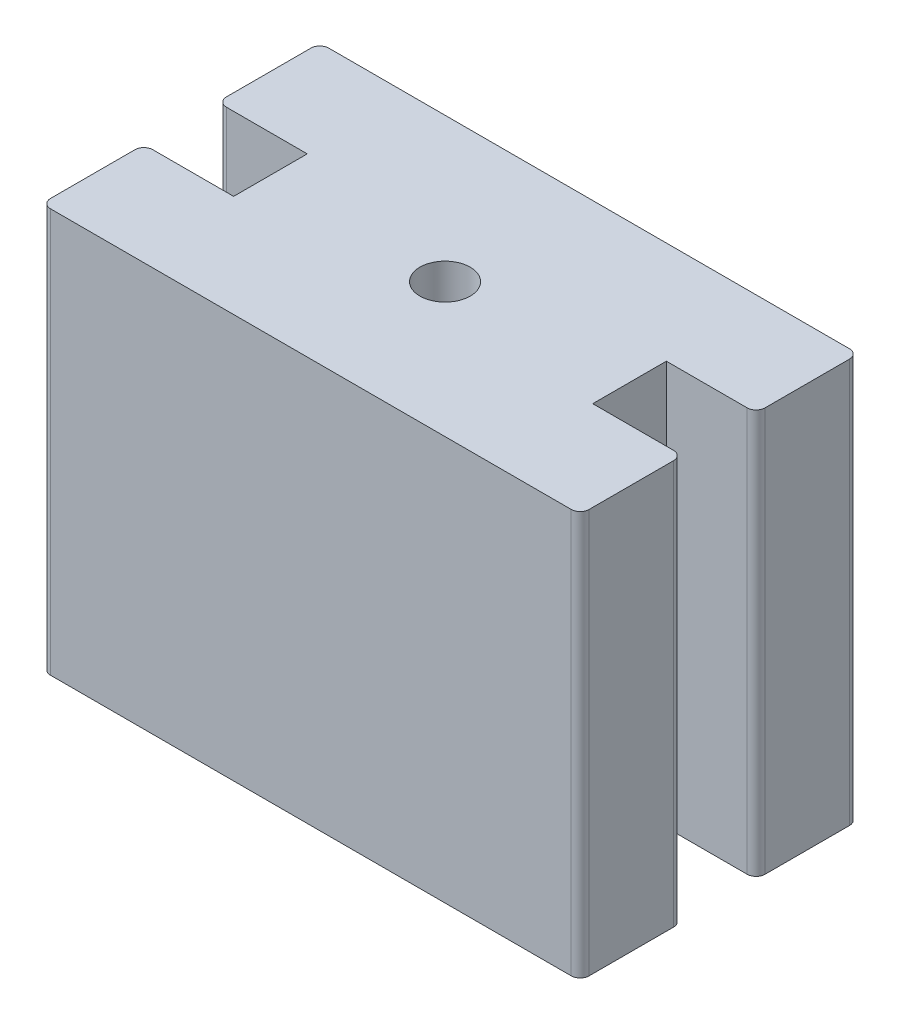
ISO-10303-21;
HEADER;
FILE_DESCRIPTION(('STEP AP214'),'2;1');
FILE_NAME('part.step','',(''),(''),'','','');
FILE_SCHEMA(('AUTOMOTIVE_DESIGN { 1 0 10303 214 1 1 1 1 }'));
ENDSEC;
DATA;
#1=APPLICATION_CONTEXT('core data for automotive mechanical design processes');
#2=APPLICATION_PROTOCOL_DEFINITION('international standard','automotive_design',2000,#1);
#3=PRODUCT_CONTEXT('',#1,'mechanical');
#4=PRODUCT('Part','Part','',(#3));
#5=PRODUCT_RELATED_PRODUCT_CATEGORY('part','',(#4));
#6=PRODUCT_DEFINITION_FORMATION('','',#4);
#7=PRODUCT_DEFINITION_CONTEXT('part definition',#1,'design');
#8=PRODUCT_DEFINITION('design','',#6,#7);
#9=PRODUCT_DEFINITION_SHAPE('','',#8);
#10=(LENGTH_UNIT() NAMED_UNIT(*) SI_UNIT(.MILLI.,.METRE.));
#11=(NAMED_UNIT(*) PLANE_ANGLE_UNIT() SI_UNIT($,.RADIAN.));
#12=(NAMED_UNIT(*) SI_UNIT($,.STERADIAN.) SOLID_ANGLE_UNIT());
#13=UNCERTAINTY_MEASURE_WITH_UNIT(LENGTH_MEASURE(1.E-05),#10,'distance_accuracy_value','');
#14=(GEOMETRIC_REPRESENTATION_CONTEXT(3) GLOBAL_UNCERTAINTY_ASSIGNED_CONTEXT((#13)) GLOBAL_UNIT_ASSIGNED_CONTEXT((#10,
#11,#12)) REPRESENTATION_CONTEXT('',''));
#15=CARTESIAN_POINT('',(0.,0.,0.));
#16=DIRECTION('',(0.,0.,1.));
#17=DIRECTION('',(1.,0.,0.));
#18=AXIS2_PLACEMENT_3D('',#15,#16,#17);
#19=CARTESIAN_POINT('',(29.,45.,-15.05));
#20=DIRECTION('',(0.,-1.,0.));
#21=DIRECTION('',(0.,0.,-1.));
#22=AXIS2_PLACEMENT_3D('',#19,#20,#21);
#23=CYLINDRICAL_SURFACE('',#22,0.999999999999999);
#24=CARTESIAN_POINT('',(29.,0.,-15.05));
#25=DIRECTION('',(0.,1.,0.));
#26=DIRECTION('',(0.,0.,1.));
#27=AXIS2_PLACEMENT_3D('',#24,#25,#26);
#28=CIRCLE('',#27,0.999999999999999);
#29=CARTESIAN_POINT('',(29.,0.,-16.05));
#30=VERTEX_POINT('',#29);
#31=CARTESIAN_POINT('',(30.,0.,-15.05));
#32=VERTEX_POINT('',#31);
#33=EDGE_CURVE('E292',#30,#32,#28,.F.);
#34=ORIENTED_EDGE('',*,*,#33,.F.);
#35=DIRECTION('',(0.,-1.,0.));
#36=VECTOR('',#35,1.);
#37=CARTESIAN_POINT('',(29.,45.,-16.05));
#38=LINE('',#37,#36);
#39=CARTESIAN_POINT('',(29.,45.,-16.05));
#40=VERTEX_POINT('',#39);
#41=EDGE_CURVE('E11',#40,#30,#38,.T.);
#42=ORIENTED_EDGE('',*,*,#41,.F.);
#43=CARTESIAN_POINT('',(29.,45.,-15.05));
#44=DIRECTION('',(0.,1.,0.));
#45=DIRECTION('',(0.,0.,1.));
#46=AXIS2_PLACEMENT_3D('',#43,#44,#45);
#47=CIRCLE('',#46,0.999999999999999);
#48=CARTESIAN_POINT('',(30.,45.,-15.05));
#49=VERTEX_POINT('',#48);
#50=EDGE_CURVE('E451',#40,#49,#47,.F.);
#51=ORIENTED_EDGE('',*,*,#50,.T.);
#52=DIRECTION('',(0.,-1.,0.));
#53=VECTOR('',#52,1.);
#54=CARTESIAN_POINT('',(30.,45.,-15.05));
#55=LINE('',#54,#53);
#56=EDGE_CURVE('E64',#49,#32,#55,.T.);
#57=ORIENTED_EDGE('',*,*,#56,.T.);
#58=EDGE_LOOP('',(#34,#42,#51,#57));
#59=FACE_BOUND('',#58,.T.);
#60=ADVANCED_FACE('F50',(#59),#23,.T.);
#61=CARTESIAN_POINT('',(0.,45.,-16.05));
#62=DIRECTION('',(0.,0.,-1.));
#63=DIRECTION('',(-1.,0.,0.));
#64=AXIS2_PLACEMENT_3D('',#61,#62,#63);
#65=PLANE('',#64);
#66=DIRECTION('',(1.,0.,0.));
#67=VECTOR('',#66,1.);
#68=CARTESIAN_POINT('',(0.,0.,-16.05));
#69=LINE('',#68,#67);
#70=CARTESIAN_POINT('',(-29.,0.,-16.05));
#71=VERTEX_POINT('',#70);
#72=EDGE_CURVE('E283',#71,#30,#69,.T.);
#73=ORIENTED_EDGE('',*,*,#72,.F.);
#74=DIRECTION('',(0.,-1.,0.));
#75=VECTOR('',#74,1.);
#76=CARTESIAN_POINT('',(-29.,45.,-16.05));
#77=LINE('',#76,#75);
#78=CARTESIAN_POINT('',(-29.,45.,-16.05));
#79=VERTEX_POINT('',#78);
#80=EDGE_CURVE('E60',#79,#71,#77,.T.);
#81=ORIENTED_EDGE('',*,*,#80,.F.);
#82=DIRECTION('',(1.,0.,0.));
#83=VECTOR('',#82,1.);
#84=CARTESIAN_POINT('',(0.,45.,-16.05));
#85=LINE('',#84,#83);
#86=EDGE_CURVE('E457',#79,#40,#85,.T.);
#87=ORIENTED_EDGE('',*,*,#86,.T.);
#88=ORIENTED_EDGE('',*,*,#41,.T.);
#89=EDGE_LOOP('',(#73,#81,#87,#88));
#90=FACE_BOUND('',#89,.T.);
#91=ADVANCED_FACE('F289',(#90),#65,.T.);
#92=CARTESIAN_POINT('',(-29.,45.,-15.05));
#93=DIRECTION('',(0.,-1.,0.));
#94=DIRECTION('',(0.,0.,-1.));
#95=AXIS2_PLACEMENT_3D('',#92,#93,#94);
#96=CYLINDRICAL_SURFACE('',#95,1.);
#97=CARTESIAN_POINT('',(-29.,0.,-15.05));
#98=DIRECTION('',(0.,1.,0.));
#99=DIRECTION('',(0.,0.,1.));
#100=AXIS2_PLACEMENT_3D('',#97,#98,#99);
#101=CIRCLE('',#100,1.);
#102=CARTESIAN_POINT('',(-30.,0.,-15.05));
#103=VERTEX_POINT('',#102);
#104=EDGE_CURVE('E273',#71,#103,#101,.T.);
#105=ORIENTED_EDGE('',*,*,#104,.T.);
#106=DIRECTION('',(0.,-1.,0.));
#107=VECTOR('',#106,1.);
#108=CARTESIAN_POINT('',(-30.,45.,-15.05));
#109=LINE('',#108,#107);
#110=CARTESIAN_POINT('',(-30.,45.,-15.05));
#111=VERTEX_POINT('',#110);
#112=EDGE_CURVE('E262',#111,#103,#109,.T.);
#113=ORIENTED_EDGE('',*,*,#112,.F.);
#114=CARTESIAN_POINT('',(-29.,45.,-15.05));
#115=DIRECTION('',(0.,1.,0.));
#116=DIRECTION('',(0.,0.,1.));
#117=AXIS2_PLACEMENT_3D('',#114,#115,#116);
#118=CIRCLE('',#117,1.);
#119=EDGE_CURVE('E277',#79,#111,#118,.T.);
#120=ORIENTED_EDGE('',*,*,#119,.F.);
#121=ORIENTED_EDGE('',*,*,#80,.T.);
#122=EDGE_LOOP('',(#105,#113,#120,#121));
#123=FACE_BOUND('',#122,.T.);
#124=ADVANCED_FACE('F275',(#123),#96,.T.);
#125=CARTESIAN_POINT('',(-30.,45.,0.));
#126=DIRECTION('',(1.,0.,0.));
#127=DIRECTION('',(0.,0.,-1.));
#128=AXIS2_PLACEMENT_3D('',#125,#126,#127);
#129=PLANE('',#128);
#130=DIRECTION('',(0.,0.,1.));
#131=VECTOR('',#130,1.);
#132=CARTESIAN_POINT('',(-30.,0.,0.));
#133=LINE('',#132,#131);
#134=CARTESIAN_POINT('',(-30.,0.,-5.65000000000001));
#135=VERTEX_POINT('',#134);
#136=EDGE_CURVE('E288',#103,#135,#133,.T.);
#137=ORIENTED_EDGE('',*,*,#136,.T.);
#138=DIRECTION('',(0.,-1.,0.));
#139=VECTOR('',#138,1.);
#140=CARTESIAN_POINT('',(-30.,45.,-5.65000000000001));
#141=LINE('',#140,#139);
#142=CARTESIAN_POINT('',(-30.,45.,-5.65000000000001));
#143=VERTEX_POINT('',#142);
#144=EDGE_CURVE('E257',#143,#135,#141,.T.);
#145=ORIENTED_EDGE('',*,*,#144,.F.);
#146=DIRECTION('',(0.,0.,1.));
#147=VECTOR('',#146,1.);
#148=CARTESIAN_POINT('',(-30.,45.,0.));
#149=LINE('',#148,#147);
#150=EDGE_CURVE('E462',#111,#143,#149,.T.);
#151=ORIENTED_EDGE('',*,*,#150,.F.);
#152=ORIENTED_EDGE('',*,*,#112,.T.);
#153=EDGE_LOOP('',(#137,#145,#151,#152));
#154=FACE_BOUND('',#153,.T.);
#155=ADVANCED_FACE('F390',(#154),#129,.F.);
#156=CARTESIAN_POINT('',(-29.,45.,-5.65));
#157=DIRECTION('',(0.,-1.,0.));
#158=DIRECTION('',(0.,0.,-1.));
#159=AXIS2_PLACEMENT_3D('',#156,#157,#158);
#160=CYLINDRICAL_SURFACE('',#159,1.);
#161=CARTESIAN_POINT('',(-29.,0.,-5.65));
#162=DIRECTION('',(0.,1.,0.));
#163=DIRECTION('',(0.,0.,1.));
#164=AXIS2_PLACEMENT_3D('',#161,#162,#163);
#165=CIRCLE('',#164,1.);
#166=CARTESIAN_POINT('',(-29.,0.,-4.65));
#167=VERTEX_POINT('',#166);
#168=EDGE_CURVE('E299',#135,#167,#165,.T.);
#169=ORIENTED_EDGE('',*,*,#168,.T.);
#170=DIRECTION('',(0.,-1.,0.));
#171=VECTOR('',#170,1.);
#172=CARTESIAN_POINT('',(-29.,45.,-4.65));
#173=LINE('',#172,#171);
#174=CARTESIAN_POINT('',(-29.,45.,-4.65));
#175=VERTEX_POINT('',#174);
#176=EDGE_CURVE('E258',#175,#167,#173,.T.);
#177=ORIENTED_EDGE('',*,*,#176,.F.);
#178=CARTESIAN_POINT('',(-29.,45.,-5.65));
#179=DIRECTION('',(0.,1.,0.));
#180=DIRECTION('',(0.,0.,1.));
#181=AXIS2_PLACEMENT_3D('',#178,#179,#180);
#182=CIRCLE('',#181,1.);
#183=EDGE_CURVE('E470',#143,#175,#182,.T.);
#184=ORIENTED_EDGE('',*,*,#183,.F.);
#185=ORIENTED_EDGE('',*,*,#144,.T.);
#186=EDGE_LOOP('',(#169,#177,#184,#185));
#187=FACE_BOUND('',#186,.T.);
#188=ADVANCED_FACE('F388',(#187),#160,.T.);
#189=CARTESIAN_POINT('',(0.,45.,-4.65));
#190=DIRECTION('',(0.,0.,-1.));
#191=DIRECTION('',(-1.,0.,0.));
#192=AXIS2_PLACEMENT_3D('',#189,#190,#191);
#193=PLANE('',#192);
#194=DIRECTION('',(1.,0.,0.));
#195=VECTOR('',#194,1.);
#196=CARTESIAN_POINT('',(0.,0.,-4.65));
#197=LINE('',#196,#195);
#198=CARTESIAN_POINT('',(-20.,0.,-4.65));
#199=VERTEX_POINT('',#198);
#200=EDGE_CURVE('E304',#167,#199,#197,.T.);
#201=ORIENTED_EDGE('',*,*,#200,.T.);
#202=DIRECTION('',(0.,-1.,0.));
#203=VECTOR('',#202,1.);
#204=CARTESIAN_POINT('',(-20.,45.,-4.65));
#205=LINE('',#204,#203);
#206=CARTESIAN_POINT('',(-20.,45.,-4.65));
#207=VERTEX_POINT('',#206);
#208=EDGE_CURVE('E252',#207,#199,#205,.T.);
#209=ORIENTED_EDGE('',*,*,#208,.F.);
#210=DIRECTION('',(1.,0.,0.));
#211=VECTOR('',#210,1.);
#212=CARTESIAN_POINT('',(0.,45.,-4.65));
#213=LINE('',#212,#211);
#214=EDGE_CURVE('E473',#175,#207,#213,.T.);
#215=ORIENTED_EDGE('',*,*,#214,.F.);
#216=ORIENTED_EDGE('',*,*,#176,.T.);
#217=EDGE_LOOP('',(#201,#209,#215,#216));
#218=FACE_BOUND('',#217,.T.);
#219=ADVANCED_FACE('F393',(#218),#193,.F.);
#220=CARTESIAN_POINT('',(-20.,45.,0.));
#221=DIRECTION('',(1.,0.,0.));
#222=DIRECTION('',(0.,0.,-1.));
#223=AXIS2_PLACEMENT_3D('',#220,#221,#222);
#224=PLANE('',#223);
#225=DIRECTION('',(0.,0.,1.));
#226=VECTOR('',#225,1.);
#227=CARTESIAN_POINT('',(-20.,0.,0.));
#228=LINE('',#227,#226);
#229=CARTESIAN_POINT('',(-20.,0.,3.55));
#230=VERTEX_POINT('',#229);
#231=EDGE_CURVE('E306',#199,#230,#228,.T.);
#232=ORIENTED_EDGE('',*,*,#231,.T.);
#233=DIRECTION('',(0.,-1.,0.));
#234=VECTOR('',#233,1.);
#235=CARTESIAN_POINT('',(-20.,45.,3.55));
#236=LINE('',#235,#234);
#237=CARTESIAN_POINT('',(-20.,45.,3.55));
#238=VERTEX_POINT('',#237);
#239=EDGE_CURVE('E249',#238,#230,#236,.T.);
#240=ORIENTED_EDGE('',*,*,#239,.F.);
#241=DIRECTION('',(0.,0.,1.));
#242=VECTOR('',#241,1.);
#243=CARTESIAN_POINT('',(-20.,45.,0.));
#244=LINE('',#243,#242);
#245=EDGE_CURVE('E474',#207,#238,#244,.T.);
#246=ORIENTED_EDGE('',*,*,#245,.F.);
#247=ORIENTED_EDGE('',*,*,#208,.T.);
#248=EDGE_LOOP('',(#232,#240,#246,#247));
#249=FACE_BOUND('',#248,.T.);
#250=ADVANCED_FACE('F396',(#249),#224,.F.);
#251=CARTESIAN_POINT('',(0.,45.,3.55));
#252=DIRECTION('',(0.,0.,-1.));
#253=DIRECTION('',(-1.,0.,0.));
#254=AXIS2_PLACEMENT_3D('',#251,#252,#253);
#255=PLANE('',#254);
#256=DIRECTION('',(1.,0.,0.));
#257=VECTOR('',#256,1.);
#258=CARTESIAN_POINT('',(0.,0.,3.55));
#259=LINE('',#258,#257);
#260=CARTESIAN_POINT('',(-29.,0.,3.55));
#261=VERTEX_POINT('',#260);
#262=EDGE_CURVE('E315',#261,#230,#259,.T.);
#263=ORIENTED_EDGE('',*,*,#262,.F.);
#264=DIRECTION('',(0.,-1.,0.));
#265=VECTOR('',#264,1.);
#266=CARTESIAN_POINT('',(-29.,45.,3.55));
#267=LINE('',#266,#265);
#268=CARTESIAN_POINT('',(-29.,45.,3.55));
#269=VERTEX_POINT('',#268);
#270=EDGE_CURVE('E248',#269,#261,#267,.T.);
#271=ORIENTED_EDGE('',*,*,#270,.F.);
#272=DIRECTION('',(1.,0.,0.));
#273=VECTOR('',#272,1.);
#274=CARTESIAN_POINT('',(0.,45.,3.55));
#275=LINE('',#274,#273);
#276=EDGE_CURVE('E476',#269,#238,#275,.T.);
#277=ORIENTED_EDGE('',*,*,#276,.T.);
#278=ORIENTED_EDGE('',*,*,#239,.T.);
#279=EDGE_LOOP('',(#263,#271,#277,#278));
#280=FACE_BOUND('',#279,.T.);
#281=ADVANCED_FACE('F405',(#280),#255,.T.);
#282=CARTESIAN_POINT('',(-29.,45.,4.55));
#283=DIRECTION('',(0.,-1.,0.));
#284=DIRECTION('',(0.,0.,-1.));
#285=AXIS2_PLACEMENT_3D('',#282,#283,#284);
#286=CYLINDRICAL_SURFACE('',#285,1.);
#287=CARTESIAN_POINT('',(-29.,0.,4.55));
#288=DIRECTION('',(0.,1.,0.));
#289=DIRECTION('',(0.,0.,1.));
#290=AXIS2_PLACEMENT_3D('',#287,#288,#289);
#291=CIRCLE('',#290,1.);
#292=CARTESIAN_POINT('',(-30.,0.,4.55));
#293=VERTEX_POINT('',#292);
#294=EDGE_CURVE('E316',#293,#261,#291,.F.);
#295=ORIENTED_EDGE('',*,*,#294,.F.);
#296=DIRECTION('',(0.,-1.,0.));
#297=VECTOR('',#296,1.);
#298=CARTESIAN_POINT('',(-30.,45.,4.55));
#299=LINE('',#298,#297);
#300=CARTESIAN_POINT('',(-30.,45.,4.55));
#301=VERTEX_POINT('',#300);
#302=EDGE_CURVE('E242',#301,#293,#299,.T.);
#303=ORIENTED_EDGE('',*,*,#302,.F.);
#304=CARTESIAN_POINT('',(-29.,45.,4.55));
#305=DIRECTION('',(0.,1.,0.));
#306=DIRECTION('',(0.,0.,1.));
#307=AXIS2_PLACEMENT_3D('',#304,#305,#306);
#308=CIRCLE('',#307,1.);
#309=EDGE_CURVE('E485',#301,#269,#308,.F.);
#310=ORIENTED_EDGE('',*,*,#309,.T.);
#311=ORIENTED_EDGE('',*,*,#270,.T.);
#312=EDGE_LOOP('',(#295,#303,#310,#311));
#313=FACE_BOUND('',#312,.T.);
#314=ADVANCED_FACE('F406',(#313),#286,.T.);
#315=CARTESIAN_POINT('',(-30.,45.,0.));
#316=DIRECTION('',(-1.,0.,0.));
#317=DIRECTION('',(0.,0.,1.));
#318=AXIS2_PLACEMENT_3D('',#315,#316,#317);
#319=PLANE('',#318);
#320=DIRECTION('',(0.,0.,-1.));
#321=VECTOR('',#320,1.);
#322=CARTESIAN_POINT('',(-30.,0.,0.));
#323=LINE('',#322,#321);
#324=CARTESIAN_POINT('',(-30.,0.,13.95));
#325=VERTEX_POINT('',#324);
#326=EDGE_CURVE('E319',#325,#293,#323,.T.);
#327=ORIENTED_EDGE('',*,*,#326,.F.);
#328=DIRECTION('',(0.,-1.,0.));
#329=VECTOR('',#328,1.);
#330=CARTESIAN_POINT('',(-30.,45.,13.95));
#331=LINE('',#330,#329);
#332=CARTESIAN_POINT('',(-30.,45.,13.95));
#333=VERTEX_POINT('',#332);
#334=EDGE_CURVE('E238',#333,#325,#331,.T.);
#335=ORIENTED_EDGE('',*,*,#334,.F.);
#336=DIRECTION('',(0.,0.,-1.));
#337=VECTOR('',#336,1.);
#338=CARTESIAN_POINT('',(-30.,45.,0.));
#339=LINE('',#338,#337);
#340=EDGE_CURVE('E486',#333,#301,#339,.T.);
#341=ORIENTED_EDGE('',*,*,#340,.T.);
#342=ORIENTED_EDGE('',*,*,#302,.T.);
#343=EDGE_LOOP('',(#327,#335,#341,#342));
#344=FACE_BOUND('',#343,.T.);
#345=ADVANCED_FACE('F409',(#344),#319,.T.);
#346=CARTESIAN_POINT('',(-29.,45.,13.95));
#347=DIRECTION('',(0.,-1.,0.));
#348=DIRECTION('',(0.,0.,-1.));
#349=AXIS2_PLACEMENT_3D('',#346,#347,#348);
#350=CYLINDRICAL_SURFACE('',#349,0.999999999999999);
#351=CARTESIAN_POINT('',(-29.,0.,13.95));
#352=DIRECTION('',(0.,1.,0.));
#353=DIRECTION('',(0.,0.,1.));
#354=AXIS2_PLACEMENT_3D('',#351,#352,#353);
#355=CIRCLE('',#354,0.999999999999999);
#356=CARTESIAN_POINT('',(-29.,0.,14.95));
#357=VERTEX_POINT('',#356);
#358=EDGE_CURVE('E322',#357,#325,#355,.F.);
#359=ORIENTED_EDGE('',*,*,#358,.F.);
#360=DIRECTION('',(0.,-1.,0.));
#361=VECTOR('',#360,1.);
#362=CARTESIAN_POINT('',(-29.,45.,14.95));
#363=LINE('',#362,#361);
#364=CARTESIAN_POINT('',(-29.,45.,14.95));
#365=VERTEX_POINT('',#364);
#366=EDGE_CURVE('E240',#365,#357,#363,.T.);
#367=ORIENTED_EDGE('',*,*,#366,.F.);
#368=CARTESIAN_POINT('',(-29.,45.,13.95));
#369=DIRECTION('',(0.,1.,0.));
#370=DIRECTION('',(0.,0.,1.));
#371=AXIS2_PLACEMENT_3D('',#368,#369,#370);
#372=CIRCLE('',#371,0.999999999999999);
#373=EDGE_CURVE('E489',#365,#333,#372,.F.);
#374=ORIENTED_EDGE('',*,*,#373,.T.);
#375=ORIENTED_EDGE('',*,*,#334,.T.);
#376=EDGE_LOOP('',(#359,#367,#374,#375));
#377=FACE_BOUND('',#376,.T.);
#378=ADVANCED_FACE('F414',(#377),#350,.T.);
#379=CARTESIAN_POINT('',(0.,45.,14.95));
#380=DIRECTION('',(0.,0.,-1.));
#381=DIRECTION('',(-1.,0.,0.));
#382=AXIS2_PLACEMENT_3D('',#379,#380,#381);
#383=PLANE('',#382);
#384=DIRECTION('',(1.,0.,0.));
#385=VECTOR('',#384,1.);
#386=CARTESIAN_POINT('',(0.,0.,14.95));
#387=LINE('',#386,#385);
#388=CARTESIAN_POINT('',(29.,0.,14.95));
#389=VERTEX_POINT('',#388);
#390=EDGE_CURVE('E327',#357,#389,#387,.T.);
#391=ORIENTED_EDGE('',*,*,#390,.T.);
#392=DIRECTION('',(0.,-1.,0.));
#393=VECTOR('',#392,1.);
#394=CARTESIAN_POINT('',(29.,45.,14.95));
#395=LINE('',#394,#393);
#396=CARTESIAN_POINT('',(29.,45.,14.95));
#397=VERTEX_POINT('',#396);
#398=EDGE_CURVE('E231',#397,#389,#395,.T.);
#399=ORIENTED_EDGE('',*,*,#398,.F.);
#400=DIRECTION('',(1.,0.,0.));
#401=VECTOR('',#400,1.);
#402=CARTESIAN_POINT('',(0.,45.,14.95));
#403=LINE('',#402,#401);
#404=EDGE_CURVE('E493',#365,#397,#403,.T.);
#405=ORIENTED_EDGE('',*,*,#404,.F.);
#406=ORIENTED_EDGE('',*,*,#366,.T.);
#407=EDGE_LOOP('',(#391,#399,#405,#406));
#408=FACE_BOUND('',#407,.T.);
#409=ADVANCED_FACE('F416',(#408),#383,.F.);
#410=CARTESIAN_POINT('',(29.,45.,13.95));
#411=DIRECTION('',(0.,-1.,0.));
#412=DIRECTION('',(0.,0.,-1.));
#413=AXIS2_PLACEMENT_3D('',#410,#411,#412);
#414=CYLINDRICAL_SURFACE('',#413,1.);
#415=CARTESIAN_POINT('',(29.,0.,13.95));
#416=DIRECTION('',(0.,1.,0.));
#417=DIRECTION('',(0.,0.,1.));
#418=AXIS2_PLACEMENT_3D('',#415,#416,#417);
#419=CIRCLE('',#418,1.);
#420=CARTESIAN_POINT('',(30.,0.,13.95));
#421=VERTEX_POINT('',#420);
#422=EDGE_CURVE('E335',#389,#421,#419,.T.);
#423=ORIENTED_EDGE('',*,*,#422,.T.);
#424=DIRECTION('',(0.,-1.,0.));
#425=VECTOR('',#424,1.);
#426=CARTESIAN_POINT('',(30.,45.,13.95));
#427=LINE('',#426,#425);
#428=CARTESIAN_POINT('',(30.,45.,13.95));
#429=VERTEX_POINT('',#428);
#430=EDGE_CURVE('E228',#429,#421,#427,.T.);
#431=ORIENTED_EDGE('',*,*,#430,.F.);
#432=CARTESIAN_POINT('',(29.,45.,13.95));
#433=DIRECTION('',(0.,1.,0.));
#434=DIRECTION('',(0.,0.,1.));
#435=AXIS2_PLACEMENT_3D('',#432,#433,#434);
#436=CIRCLE('',#435,1.);
#437=EDGE_CURVE('E499',#397,#429,#436,.T.);
#438=ORIENTED_EDGE('',*,*,#437,.F.);
#439=ORIENTED_EDGE('',*,*,#398,.T.);
#440=EDGE_LOOP('',(#423,#431,#438,#439));
#441=FACE_BOUND('',#440,.T.);
#442=ADVANCED_FACE('F425',(#441),#414,.T.);
#443=CARTESIAN_POINT('',(30.,45.,0.));
#444=DIRECTION('',(-1.,0.,0.));
#445=DIRECTION('',(0.,0.,1.));
#446=AXIS2_PLACEMENT_3D('',#443,#444,#445);
#447=PLANE('',#446);
#448=DIRECTION('',(0.,0.,-1.));
#449=VECTOR('',#448,1.);
#450=CARTESIAN_POINT('',(30.,0.,0.));
#451=LINE('',#450,#449);
#452=CARTESIAN_POINT('',(30.,0.,4.55));
#453=VERTEX_POINT('',#452);
#454=EDGE_CURVE('E336',#421,#453,#451,.T.);
#455=ORIENTED_EDGE('',*,*,#454,.T.);
#456=DIRECTION('',(0.,-1.,0.));
#457=VECTOR('',#456,1.);
#458=CARTESIAN_POINT('',(30.,45.,4.55));
#459=LINE('',#458,#457);
#460=CARTESIAN_POINT('',(30.,45.,4.55));
#461=VERTEX_POINT('',#460);
#462=EDGE_CURVE('E226',#461,#453,#459,.T.);
#463=ORIENTED_EDGE('',*,*,#462,.F.);
#464=DIRECTION('',(0.,0.,-1.));
#465=VECTOR('',#464,1.);
#466=CARTESIAN_POINT('',(30.,45.,0.));
#467=LINE('',#466,#465);
#468=EDGE_CURVE('E505',#429,#461,#467,.T.);
#469=ORIENTED_EDGE('',*,*,#468,.F.);
#470=ORIENTED_EDGE('',*,*,#430,.T.);
#471=EDGE_LOOP('',(#455,#463,#469,#470));
#472=FACE_BOUND('',#471,.T.);
#473=ADVANCED_FACE('F426',(#472),#447,.F.);
#474=CARTESIAN_POINT('',(29.,45.,4.55));
#475=DIRECTION('',(0.,-1.,0.));
#476=DIRECTION('',(0.,0.,-1.));
#477=AXIS2_PLACEMENT_3D('',#474,#475,#476);
#478=CYLINDRICAL_SURFACE('',#477,1.);
#479=CARTESIAN_POINT('',(29.,0.,4.55));
#480=DIRECTION('',(0.,1.,0.));
#481=DIRECTION('',(0.,0.,1.));
#482=AXIS2_PLACEMENT_3D('',#479,#480,#481);
#483=CIRCLE('',#482,1.);
#484=CARTESIAN_POINT('',(29.,0.,3.55));
#485=VERTEX_POINT('',#484);
#486=EDGE_CURVE('E339',#485,#453,#483,.F.);
#487=ORIENTED_EDGE('',*,*,#486,.F.);
#488=DIRECTION('',(0.,-1.,0.));
#489=VECTOR('',#488,1.);
#490=CARTESIAN_POINT('',(29.,45.,3.55));
#491=LINE('',#490,#489);
#492=CARTESIAN_POINT('',(29.,45.,3.55));
#493=VERTEX_POINT('',#492);
#494=EDGE_CURVE('E224',#493,#485,#491,.T.);
#495=ORIENTED_EDGE('',*,*,#494,.F.);
#496=CARTESIAN_POINT('',(29.,45.,4.55));
#497=DIRECTION('',(0.,1.,0.));
#498=DIRECTION('',(0.,0.,1.));
#499=AXIS2_PLACEMENT_3D('',#496,#497,#498);
#500=CIRCLE('',#499,1.);
#501=EDGE_CURVE('E504',#493,#461,#500,.F.);
#502=ORIENTED_EDGE('',*,*,#501,.T.);
#503=ORIENTED_EDGE('',*,*,#462,.T.);
#504=EDGE_LOOP('',(#487,#495,#502,#503));
#505=FACE_BOUND('',#504,.T.);
#506=ADVANCED_FACE('F429',(#505),#478,.T.);
#507=CARTESIAN_POINT('',(0.,45.,3.55));
#508=DIRECTION('',(0.,0.,-1.));
#509=DIRECTION('',(-1.,0.,0.));
#510=AXIS2_PLACEMENT_3D('',#507,#508,#509);
#511=PLANE('',#510);
#512=DIRECTION('',(1.,0.,0.));
#513=VECTOR('',#512,1.);
#514=CARTESIAN_POINT('',(0.,0.,3.55));
#515=LINE('',#514,#513);
#516=CARTESIAN_POINT('',(20.,0.,3.55));
#517=VERTEX_POINT('',#516);
#518=EDGE_CURVE('E344',#517,#485,#515,.T.);
#519=ORIENTED_EDGE('',*,*,#518,.F.);
#520=DIRECTION('',(0.,-1.,0.));
#521=VECTOR('',#520,1.);
#522=CARTESIAN_POINT('',(20.,45.,3.55));
#523=LINE('',#522,#521);
#524=CARTESIAN_POINT('',(20.,45.,3.55));
#525=VERTEX_POINT('',#524);
#526=EDGE_CURVE('E216',#525,#517,#523,.T.);
#527=ORIENTED_EDGE('',*,*,#526,.F.);
#528=DIRECTION('',(1.,0.,0.));
#529=VECTOR('',#528,1.);
#530=CARTESIAN_POINT('',(0.,45.,3.55));
#531=LINE('',#530,#529);
#532=EDGE_CURVE('E509',#525,#493,#531,.T.);
#533=ORIENTED_EDGE('',*,*,#532,.T.);
#534=ORIENTED_EDGE('',*,*,#494,.T.);
#535=EDGE_LOOP('',(#519,#527,#533,#534));
#536=FACE_BOUND('',#535,.T.);
#537=ADVANCED_FACE('F432',(#536),#511,.T.);
#538=CARTESIAN_POINT('',(20.,45.,0.));
#539=DIRECTION('',(1.,0.,0.));
#540=DIRECTION('',(0.,0.,-1.));
#541=AXIS2_PLACEMENT_3D('',#538,#539,#540);
#542=PLANE('',#541);
#543=DIRECTION('',(0.,0.,1.));
#544=VECTOR('',#543,1.);
#545=CARTESIAN_POINT('',(20.,0.,0.));
#546=LINE('',#545,#544);
#547=CARTESIAN_POINT('',(20.,0.,-4.65));
#548=VERTEX_POINT('',#547);
#549=EDGE_CURVE('E346',#548,#517,#546,.T.);
#550=ORIENTED_EDGE('',*,*,#549,.F.);
#551=DIRECTION('',(0.,-1.,0.));
#552=VECTOR('',#551,1.);
#553=CARTESIAN_POINT('',(20.,45.,-4.65));
#554=LINE('',#553,#552);
#555=CARTESIAN_POINT('',(20.,45.,-4.65));
#556=VERTEX_POINT('',#555);
#557=EDGE_CURVE('E215',#556,#548,#554,.T.);
#558=ORIENTED_EDGE('',*,*,#557,.F.);
#559=DIRECTION('',(0.,0.,1.));
#560=VECTOR('',#559,1.);
#561=CARTESIAN_POINT('',(20.,45.,0.));
#562=LINE('',#561,#560);
#563=EDGE_CURVE('E204',#556,#525,#562,.T.);
#564=ORIENTED_EDGE('',*,*,#563,.T.);
#565=ORIENTED_EDGE('',*,*,#526,.T.);
#566=EDGE_LOOP('',(#550,#558,#564,#565));
#567=FACE_BOUND('',#566,.T.);
#568=ADVANCED_FACE('F437',(#567),#542,.T.);
#569=CARTESIAN_POINT('',(0.,45.,-4.65));
#570=DIRECTION('',(0.,0.,-1.));
#571=DIRECTION('',(-1.,0.,0.));
#572=AXIS2_PLACEMENT_3D('',#569,#570,#571);
#573=PLANE('',#572);
#574=DIRECTION('',(1.,0.,0.));
#575=VECTOR('',#574,1.);
#576=CARTESIAN_POINT('',(0.,0.,-4.65));
#577=LINE('',#576,#575);
#578=CARTESIAN_POINT('',(29.,0.,-4.65));
#579=VERTEX_POINT('',#578);
#580=EDGE_CURVE('E209',#548,#579,#577,.T.);
#581=ORIENTED_EDGE('',*,*,#580,.T.);
#582=DIRECTION('',(0.,-1.,0.));
#583=VECTOR('',#582,1.);
#584=CARTESIAN_POINT('',(29.,45.,-4.65));
#585=LINE('',#584,#583);
#586=CARTESIAN_POINT('',(29.,45.,-4.65));
#587=VERTEX_POINT('',#586);
#588=EDGE_CURVE('E193',#587,#579,#585,.T.);
#589=ORIENTED_EDGE('',*,*,#588,.F.);
#590=DIRECTION('',(1.,0.,0.));
#591=VECTOR('',#590,1.);
#592=CARTESIAN_POINT('',(0.,45.,-4.65));
#593=LINE('',#592,#591);
#594=EDGE_CURVE('E197',#556,#587,#593,.T.);
#595=ORIENTED_EDGE('',*,*,#594,.F.);
#596=ORIENTED_EDGE('',*,*,#557,.T.);
#597=EDGE_LOOP('',(#581,#589,#595,#596));
#598=FACE_BOUND('',#597,.T.);
#599=ADVANCED_FACE('F208',(#598),#573,.F.);
#600=CARTESIAN_POINT('',(29.,45.,-5.65));
#601=DIRECTION('',(0.,-1.,0.));
#602=DIRECTION('',(0.,0.,-1.));
#603=AXIS2_PLACEMENT_3D('',#600,#601,#602);
#604=CYLINDRICAL_SURFACE('',#603,1.);
#605=CARTESIAN_POINT('',(29.,0.,-5.65));
#606=DIRECTION('',(0.,1.,0.));
#607=DIRECTION('',(0.,0.,1.));
#608=AXIS2_PLACEMENT_3D('',#605,#606,#607);
#609=CIRCLE('',#608,1.);
#610=CARTESIAN_POINT('',(30.,0.,-5.65000000000001));
#611=VERTEX_POINT('',#610);
#612=EDGE_CURVE('E353',#579,#611,#609,.T.);
#613=ORIENTED_EDGE('',*,*,#612,.T.);
#614=DIRECTION('',(0.,-1.,0.));
#615=VECTOR('',#614,1.);
#616=CARTESIAN_POINT('',(30.,45.,-5.65000000000001));
#617=LINE('',#616,#615);
#618=CARTESIAN_POINT('',(30.,45.,-5.65000000000001));
#619=VERTEX_POINT('',#618);
#620=EDGE_CURVE('E130',#619,#611,#617,.T.);
#621=ORIENTED_EDGE('',*,*,#620,.F.);
#622=CARTESIAN_POINT('',(29.,45.,-5.65));
#623=DIRECTION('',(0.,1.,0.));
#624=DIRECTION('',(0.,0.,1.));
#625=AXIS2_PLACEMENT_3D('',#622,#623,#624);
#626=CIRCLE('',#625,1.);
#627=EDGE_CURVE('E190',#587,#619,#626,.T.);
#628=ORIENTED_EDGE('',*,*,#627,.F.);
#629=ORIENTED_EDGE('',*,*,#588,.T.);
#630=EDGE_LOOP('',(#613,#621,#628,#629));
#631=FACE_BOUND('',#630,.T.);
#632=ADVANCED_FACE('F188',(#631),#604,.T.);
#633=CARTESIAN_POINT('',(0.,45.,0.));
#634=DIRECTION('',(0.,-1.,0.));
#635=DIRECTION('',(0.,0.,-1.));
#636=AXIS2_PLACEMENT_3D('',#633,#634,#635);
#637=CYLINDRICAL_SURFACE('',#636,2.8);
#638=CARTESIAN_POINT('',(0.,45.,0.));
#639=DIRECTION('',(0.,1.,0.));
#640=DIRECTION('',(0.,0.,1.));
#641=AXIS2_PLACEMENT_3D('',#638,#639,#640);
#642=CIRCLE('',#641,2.8);
#643=CARTESIAN_POINT('',(0.,45.,-2.8));
#644=VERTEX_POINT('',#643);
#645=EDGE_CURVE('E357',#644,#644,#642,.T.);
#646=CARTESIAN_POINT('',(0.,0.,0.));
#647=DIRECTION('',(0.,1.,0.));
#648=DIRECTION('',(0.,0.,1.));
#649=AXIS2_PLACEMENT_3D('',#646,#647,#648);
#650=CIRCLE('',#649,2.8);
#651=CARTESIAN_POINT('',(0.,0.,-2.8));
#652=VERTEX_POINT('',#651);
#653=EDGE_CURVE('E294',#652,#652,#650,.T.);
#654=CARTESIAN_POINT('',(0.,45.,-2.8));
#655=CARTESIAN_POINT('',(0.,44.53125,-2.8));
#656=CARTESIAN_POINT('',(0.,44.0625,-2.8));
#657=CARTESIAN_POINT('',(0.,43.125,-2.8));
#658=CARTESIAN_POINT('',(0.,42.65625,-2.8));
#659=CARTESIAN_POINT('',(0.,41.71875,-2.8));
#660=CARTESIAN_POINT('',(0.,41.25,-2.8));
#661=CARTESIAN_POINT('',(0.,40.3125,-2.8));
#662=CARTESIAN_POINT('',(0.,39.84375,-2.8));
#663=CARTESIAN_POINT('',(0.,38.90625,-2.8));
#664=CARTESIAN_POINT('',(0.,38.4375,-2.8));
#665=CARTESIAN_POINT('',(0.,37.5,-2.8));
#666=CARTESIAN_POINT('',(0.,37.03125,-2.8));
#667=CARTESIAN_POINT('',(0.,36.09375,-2.8));
#668=CARTESIAN_POINT('',(0.,35.625,-2.8));
#669=CARTESIAN_POINT('',(0.,34.6875,-2.8));
#670=CARTESIAN_POINT('',(0.,34.21875,-2.8));
#671=CARTESIAN_POINT('',(0.,33.28125,-2.8));
#672=CARTESIAN_POINT('',(0.,32.8125,-2.8));
#673=CARTESIAN_POINT('',(0.,31.875,-2.8));
#674=CARTESIAN_POINT('',(0.,31.40625,-2.8));
#675=CARTESIAN_POINT('',(0.,30.46875,-2.8));
#676=CARTESIAN_POINT('',(0.,30.,-2.8));
#677=CARTESIAN_POINT('',(0.,29.0625,-2.8));
#678=CARTESIAN_POINT('',(0.,28.59375,-2.8));
#679=CARTESIAN_POINT('',(0.,27.65625,-2.8));
#680=CARTESIAN_POINT('',(0.,27.1875,-2.8));
#681=CARTESIAN_POINT('',(0.,26.25,-2.8));
#682=CARTESIAN_POINT('',(0.,25.78125,-2.8));
#683=CARTESIAN_POINT('',(0.,24.84375,-2.8));
#684=CARTESIAN_POINT('',(0.,24.375,-2.8));
#685=CARTESIAN_POINT('',(0.,23.4375,-2.8));
#686=CARTESIAN_POINT('',(0.,22.96875,-2.8));
#687=CARTESIAN_POINT('',(0.,22.03125,-2.8));
#688=CARTESIAN_POINT('',(0.,21.5625,-2.8));
#689=CARTESIAN_POINT('',(0.,20.625,-2.8));
#690=CARTESIAN_POINT('',(0.,20.15625,-2.8));
#691=CARTESIAN_POINT('',(0.,19.21875,-2.8));
#692=CARTESIAN_POINT('',(0.,18.75,-2.8));
#693=CARTESIAN_POINT('',(0.,17.8125,-2.8));
#694=CARTESIAN_POINT('',(0.,17.34375,-2.8));
#695=CARTESIAN_POINT('',(0.,16.40625,-2.8));
#696=CARTESIAN_POINT('',(0.,15.9375,-2.8));
#697=CARTESIAN_POINT('',(0.,15.,-2.8));
#698=CARTESIAN_POINT('',(0.,14.53125,-2.8));
#699=CARTESIAN_POINT('',(0.,13.59375,-2.8));
#700=CARTESIAN_POINT('',(0.,13.125,-2.8));
#701=CARTESIAN_POINT('',(0.,12.1875,-2.8));
#702=CARTESIAN_POINT('',(0.,11.71875,-2.8));
#703=CARTESIAN_POINT('',(0.,10.78125,-2.8));
#704=CARTESIAN_POINT('',(0.,10.3125,-2.8));
#705=CARTESIAN_POINT('',(0.,9.37499999999999,-2.8));
#706=CARTESIAN_POINT('',(0.,8.90624999999999,-2.8));
#707=CARTESIAN_POINT('',(0.,7.96874999999999,-2.8));
#708=CARTESIAN_POINT('',(0.,7.5,-2.8));
#709=CARTESIAN_POINT('',(0.,6.56249999999999,-2.8));
#710=CARTESIAN_POINT('',(0.,6.09374999999999,-2.8));
#711=CARTESIAN_POINT('',(0.,5.15624999999999,-2.8));
#712=CARTESIAN_POINT('',(0.,4.68749999999999,-2.8));
#713=CARTESIAN_POINT('',(0.,3.74999999999999,-2.8));
#714=CARTESIAN_POINT('',(0.,3.28124999999999,-2.8));
#715=CARTESIAN_POINT('',(0.,2.34374999999999,-2.8));
#716=CARTESIAN_POINT('',(0.,1.87499999999999,-2.8));
#717=CARTESIAN_POINT('',(0.,0.937499999999992,-2.8));
#718=CARTESIAN_POINT('',(0.,0.468749999999993,-2.8));
#719=CARTESIAN_POINT('',(0.,0.,-2.8));
#720=B_SPLINE_CURVE_WITH_KNOTS('',3,(#654,#655,#656,#657,#658,#659,#660,#661,#662,#663,#664,
#665,#666,#667,#668,#669,#670,#671,#672,#673,#674,#675,#676,#677,#678,#679,#680,#681,#682,#683,
#684,#685,#686,#687,#688,#689,#690,#691,#692,#693,#694,#695,#696,#697,#698,#699,#700,#701,#702,
#703,#704,#705,#706,#707,#708,#709,#710,#711,#712,#713,#714,#715,#716,#717,#718,#719),
.UNSPECIFIED.,.F.,.F.,(4,2,2,2,2,2,2,2,2,2,2,2,2,2,2,2,2,2,2,2,2,2,2,2,2,2,2,2,2,2,2,2,4),(0.,
1.40625,2.8125,4.21874999999999,5.625,7.03125,8.43749999999999,9.84375,11.25,12.65625,14.0625,
15.46875,16.875,18.28125,19.6875,21.09375,22.5,23.90625,25.3125,26.71875,28.125,29.53125,
30.9375,32.34375,33.75,35.15625,36.5625,37.96875,39.375,40.78125,42.1875,43.59375,45.),.UNSPECIFIED.);
#721=EDGE_CURVE('BSEAM47',#644,#652,#720,.T.);
#722=ORIENTED_EDGE('',*,*,#645,.T.);
#723=ORIENTED_EDGE('',*,*,#653,.F.);
#724=ORIENTED_EDGE('',*,*,#721,.T.);
#725=ORIENTED_EDGE('',*,*,#721,.F.);
#726=EDGE_LOOP('',(#722,#724,#723,#725));
#727=FACE_BOUND('',#726,.T.);
#728=ADVANCED_FACE('F47',(#727),#637,.F.);
#729=CARTESIAN_POINT('',(30.,45.,0.));
#730=DIRECTION('',(1.,0.,0.));
#731=DIRECTION('',(0.,0.,-1.));
#732=AXIS2_PLACEMENT_3D('',#729,#730,#731);
#733=PLANE('',#732);
#734=DIRECTION('',(0.,0.,1.));
#735=VECTOR('',#734,1.);
#736=CARTESIAN_POINT('',(30.,0.,0.));
#737=LINE('',#736,#735);
#738=EDGE_CURVE('E360',#32,#611,#737,.T.);
#739=ORIENTED_EDGE('',*,*,#738,.F.);
#740=ORIENTED_EDGE('',*,*,#56,.F.);
#741=DIRECTION('',(0.,0.,1.));
#742=VECTOR('',#741,1.);
#743=CARTESIAN_POINT('',(30.,45.,0.));
#744=LINE('',#743,#742);
#745=EDGE_CURVE('E198',#49,#619,#744,.T.);
#746=ORIENTED_EDGE('',*,*,#745,.T.);
#747=ORIENTED_EDGE('',*,*,#620,.T.);
#748=EDGE_LOOP('',(#739,#740,#746,#747));
#749=FACE_BOUND('',#748,.T.);
#750=ADVANCED_FACE('F367',(#749),#733,.T.);
#751=CARTESIAN_POINT('',(0.,45.,0.));
#752=DIRECTION('',(0.,1.,0.));
#753=DIRECTION('',(0.,0.,1.));
#754=AXIS2_PLACEMENT_3D('',#751,#752,#753);
#755=PLANE('',#754);
#756=ORIENTED_EDGE('',*,*,#645,.F.);
#757=EDGE_LOOP('',(#756));
#758=FACE_BOUND('',#757,.T.);
#759=ORIENTED_EDGE('',*,*,#50,.F.);
#760=ORIENTED_EDGE('',*,*,#86,.F.);
#761=ORIENTED_EDGE('',*,*,#119,.T.);
#762=ORIENTED_EDGE('',*,*,#150,.T.);
#763=ORIENTED_EDGE('',*,*,#183,.T.);
#764=ORIENTED_EDGE('',*,*,#214,.T.);
#765=ORIENTED_EDGE('',*,*,#245,.T.);
#766=ORIENTED_EDGE('',*,*,#276,.F.);
#767=ORIENTED_EDGE('',*,*,#309,.F.);
#768=ORIENTED_EDGE('',*,*,#340,.F.);
#769=ORIENTED_EDGE('',*,*,#373,.F.);
#770=ORIENTED_EDGE('',*,*,#404,.T.);
#771=ORIENTED_EDGE('',*,*,#437,.T.);
#772=ORIENTED_EDGE('',*,*,#468,.T.);
#773=ORIENTED_EDGE('',*,*,#501,.F.);
#774=ORIENTED_EDGE('',*,*,#532,.F.);
#775=ORIENTED_EDGE('',*,*,#563,.F.);
#776=ORIENTED_EDGE('',*,*,#594,.T.);
#777=ORIENTED_EDGE('',*,*,#627,.T.);
#778=ORIENTED_EDGE('',*,*,#745,.F.);
#779=EDGE_LOOP('',(#759,#760,#761,#762,#763,#764,#765,#766,#767,#768,#769,#770,#771,#772,#773,
#774,#775,#776,#777,#778));
#780=FACE_BOUND('',#779,.T.);
#781=ADVANCED_FACE('F203',(#758,#780),#755,.T.);
#782=CARTESIAN_POINT('',(0.,0.,0.));
#783=DIRECTION('',(0.,1.,0.));
#784=DIRECTION('',(0.,0.,1.));
#785=AXIS2_PLACEMENT_3D('',#782,#783,#784);
#786=PLANE('',#785);
#787=ORIENTED_EDGE('',*,*,#653,.T.);
#788=EDGE_LOOP('',(#787));
#789=FACE_BOUND('',#788,.T.);
#790=ORIENTED_EDGE('',*,*,#33,.T.);
#791=ORIENTED_EDGE('',*,*,#738,.T.);
#792=ORIENTED_EDGE('',*,*,#612,.F.);
#793=ORIENTED_EDGE('',*,*,#580,.F.);
#794=ORIENTED_EDGE('',*,*,#549,.T.);
#795=ORIENTED_EDGE('',*,*,#518,.T.);
#796=ORIENTED_EDGE('',*,*,#486,.T.);
#797=ORIENTED_EDGE('',*,*,#454,.F.);
#798=ORIENTED_EDGE('',*,*,#422,.F.);
#799=ORIENTED_EDGE('',*,*,#390,.F.);
#800=ORIENTED_EDGE('',*,*,#358,.T.);
#801=ORIENTED_EDGE('',*,*,#326,.T.);
#802=ORIENTED_EDGE('',*,*,#294,.T.);
#803=ORIENTED_EDGE('',*,*,#262,.T.);
#804=ORIENTED_EDGE('',*,*,#231,.F.);
#805=ORIENTED_EDGE('',*,*,#200,.F.);
#806=ORIENTED_EDGE('',*,*,#168,.F.);
#807=ORIENTED_EDGE('',*,*,#136,.F.);
#808=ORIENTED_EDGE('',*,*,#104,.F.);
#809=ORIENTED_EDGE('',*,*,#72,.T.);
#810=EDGE_LOOP('',(#790,#791,#792,#793,#794,#795,#796,#797,#798,#799,#800,#801,#802,#803,#804,
#805,#806,#807,#808,#809));
#811=FACE_BOUND('',#810,.T.);
#812=ADVANCED_FACE('F282',(#789,#811),#786,.F.);
#813=CLOSED_SHELL('',(#60,#91,#124,#155,#188,#219,#250,#281,#314,#345,#378,#409,#442,#473,#506,
#537,#568,#599,#632,#728,#750,#781,#812));
#814=MANIFOLD_SOLID_BREP('B2',#813);
#815=ADVANCED_BREP_SHAPE_REPRESENTATION('',(#18,#814),#14);
#816=SHAPE_DEFINITION_REPRESENTATION(#9,#815);
ENDSEC;
END-ISO-10303-21;
